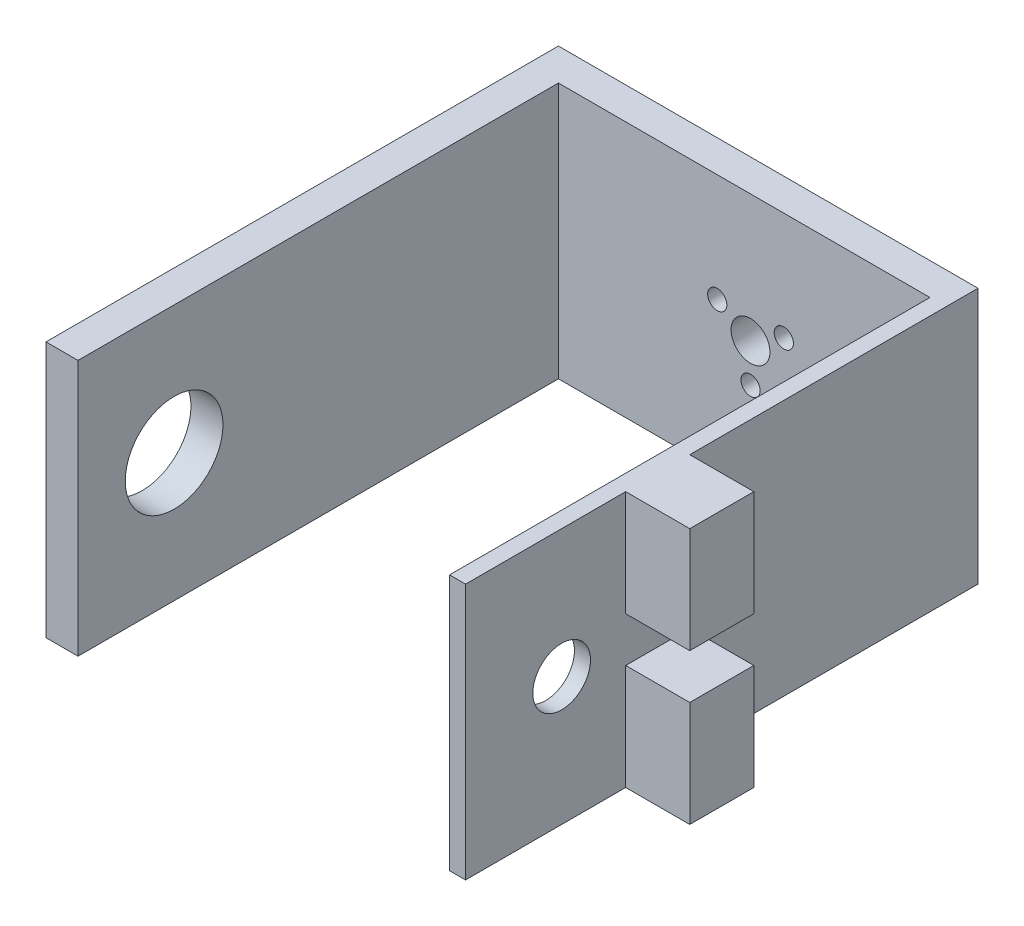
ISO-10303-21;
HEADER;
FILE_DESCRIPTION(('STEP AP214'),'2;1');
FILE_NAME('part.step','',(''),(''),'','','');
FILE_SCHEMA(('AUTOMOTIVE_DESIGN { 1 0 10303 214 1 1 1 1 }'));
ENDSEC;
DATA;
#1=APPLICATION_CONTEXT('core data for automotive mechanical design processes');
#2=APPLICATION_PROTOCOL_DEFINITION('international standard','automotive_design',2000,#1);
#3=PRODUCT_CONTEXT('',#1,'mechanical');
#4=PRODUCT('Part','Part','',(#3));
#5=PRODUCT_RELATED_PRODUCT_CATEGORY('part','',(#4));
#6=PRODUCT_DEFINITION_FORMATION('','',#4);
#7=PRODUCT_DEFINITION_CONTEXT('part definition',#1,'design');
#8=PRODUCT_DEFINITION('design','',#6,#7);
#9=PRODUCT_DEFINITION_SHAPE('','',#8);
#10=(LENGTH_UNIT() NAMED_UNIT(*) SI_UNIT(.MILLI.,.METRE.));
#11=(NAMED_UNIT(*) PLANE_ANGLE_UNIT() SI_UNIT($,.RADIAN.));
#12=(NAMED_UNIT(*) SI_UNIT($,.STERADIAN.) SOLID_ANGLE_UNIT());
#13=UNCERTAINTY_MEASURE_WITH_UNIT(LENGTH_MEASURE(1.E-05),#10,'distance_accuracy_value','');
#14=(GEOMETRIC_REPRESENTATION_CONTEXT(3) GLOBAL_UNCERTAINTY_ASSIGNED_CONTEXT((#13)) GLOBAL_UNIT_ASSIGNED_CONTEXT((#10,
#11,#12)) REPRESENTATION_CONTEXT('',''));
#15=CARTESIAN_POINT('',(0.,0.,0.));
#16=DIRECTION('',(0.,0.,1.));
#17=DIRECTION('',(1.,0.,0.));
#18=AXIS2_PLACEMENT_3D('',#15,#16,#17);
#19=CARTESIAN_POINT('',(30.5,40.,42.2692929036653));
#20=DIRECTION('',(-1.,0.,0.));
#21=DIRECTION('',(0.,0.,1.));
#22=AXIS2_PLACEMENT_3D('',#19,#20,#21);
#23=PLANE('',#22);
#24=CARTESIAN_POINT('',(30.5,20.,27.2692929036653));
#25=DIRECTION('',(1.,0.,0.));
#26=DIRECTION('',(0.,0.,-1.));
#27=AXIS2_PLACEMENT_3D('',#24,#25,#26);
#28=CIRCLE('',#27,4.5);
#29=CARTESIAN_POINT('',(30.5,20.,22.7692929036653));
#30=VERTEX_POINT('',#29);
#31=EDGE_CURVE('E216',#30,#30,#28,.T.);
#32=ORIENTED_EDGE('',*,*,#31,.F.);
#33=EDGE_LOOP('',(#32));
#34=FACE_BOUND('',#33,.T.);
#35=DIRECTION('',(0.,0.,-1.));
#36=VECTOR('',#35,1.);
#37=CARTESIAN_POINT('',(30.5,23.5,0.));
#38=LINE('',#37,#36);
#39=CARTESIAN_POINT('',(30.5,23.5,17.2692929036653));
#40=VERTEX_POINT('',#39);
#41=CARTESIAN_POINT('',(30.5,23.5,7.26929290366533));
#42=VERTEX_POINT('',#41);
#43=EDGE_CURVE('E177',#40,#42,#38,.T.);
#44=ORIENTED_EDGE('',*,*,#43,.F.);
#45=DIRECTION('',(0.,1.,0.));
#46=VECTOR('',#45,1.);
#47=CARTESIAN_POINT('',(30.5,0.,17.2692929036653));
#48=LINE('',#47,#46);
#49=CARTESIAN_POINT('',(30.5,40.,17.2692929036653));
#50=VERTEX_POINT('',#49);
#51=EDGE_CURVE('E159',#40,#50,#48,.T.);
#52=ORIENTED_EDGE('',*,*,#51,.T.);
#53=DIRECTION('',(0.,0.,-1.));
#54=VECTOR('',#53,1.);
#55=CARTESIAN_POINT('',(30.5,40.,42.2692929036653));
#56=LINE('',#55,#54);
#57=CARTESIAN_POINT('',(30.5,40.,42.2692929036653));
#58=VERTEX_POINT('',#57);
#59=EDGE_CURVE('E262',#58,#50,#56,.T.);
#60=ORIENTED_EDGE('',*,*,#59,.F.);
#61=DIRECTION('',(0.,-1.,0.));
#62=VECTOR('',#61,1.);
#63=CARTESIAN_POINT('',(30.5,40.,42.2692929036653));
#64=LINE('',#63,#62);
#65=CARTESIAN_POINT('',(30.5,0.,42.2692929036653));
#66=VERTEX_POINT('',#65);
#67=EDGE_CURVE('E290',#58,#66,#64,.T.);
#68=ORIENTED_EDGE('',*,*,#67,.T.);
#69=DIRECTION('',(0.,0.,-1.));
#70=VECTOR('',#69,1.);
#71=CARTESIAN_POINT('',(30.5,0.,42.2692929036653));
#72=LINE('',#71,#70);
#73=CARTESIAN_POINT('',(30.5,0.,17.2692929036653));
#74=VERTEX_POINT('',#73);
#75=EDGE_CURVE('E281',#66,#74,#72,.T.);
#76=ORIENTED_EDGE('',*,*,#75,.T.);
#77=DIRECTION('',(0.,1.,0.));
#78=VECTOR('',#77,1.);
#79=CARTESIAN_POINT('',(30.5,0.,17.2692929036653));
#80=LINE('',#79,#78);
#81=CARTESIAN_POINT('',(30.5,16.5,17.2692929036653));
#82=VERTEX_POINT('',#81);
#83=EDGE_CURVE('E204',#74,#82,#80,.T.);
#84=ORIENTED_EDGE('',*,*,#83,.T.);
#85=DIRECTION('',(0.,0.,-1.));
#86=VECTOR('',#85,1.);
#87=CARTESIAN_POINT('',(30.5,16.5,0.));
#88=LINE('',#87,#86);
#89=CARTESIAN_POINT('',(30.5,16.5,7.26929290366533));
#90=VERTEX_POINT('',#89);
#91=EDGE_CURVE('E62',#82,#90,#88,.T.);
#92=ORIENTED_EDGE('',*,*,#91,.T.);
#93=DIRECTION('',(0.,1.,0.));
#94=VECTOR('',#93,1.);
#95=CARTESIAN_POINT('',(30.5,0.,7.26929290366533));
#96=LINE('',#95,#94);
#97=CARTESIAN_POINT('',(30.5,0.,7.26929290366533));
#98=VERTEX_POINT('',#97);
#99=EDGE_CURVE('E195',#98,#90,#96,.T.);
#100=ORIENTED_EDGE('',*,*,#99,.F.);
#101=CARTESIAN_POINT('',(30.5,0.,-37.7307070963347));
#102=VERTEX_POINT('',#101);
#103=EDGE_CURVE('E280',#98,#102,#72,.T.);
#104=ORIENTED_EDGE('',*,*,#103,.T.);
#105=DIRECTION('',(0.,-1.,0.));
#106=VECTOR('',#105,1.);
#107=CARTESIAN_POINT('',(30.5,40.,-37.7307070963347));
#108=LINE('',#107,#106);
#109=CARTESIAN_POINT('',(30.5,40.,-37.7307070963347));
#110=VERTEX_POINT('',#109);
#111=EDGE_CURVE('E287',#110,#102,#108,.T.);
#112=ORIENTED_EDGE('',*,*,#111,.F.);
#113=CARTESIAN_POINT('',(30.5,40.,7.26929290366533));
#114=VERTEX_POINT('',#113);
#115=EDGE_CURVE('E261',#114,#110,#56,.T.);
#116=ORIENTED_EDGE('',*,*,#115,.F.);
#117=DIRECTION('',(0.,1.,0.));
#118=VECTOR('',#117,1.);
#119=CARTESIAN_POINT('',(30.5,0.,7.26929290366533));
#120=LINE('',#119,#118);
#121=EDGE_CURVE('E175',#42,#114,#120,.T.);
#122=ORIENTED_EDGE('',*,*,#121,.F.);
#123=EDGE_LOOP('',(#44,#52,#60,#68,#76,#84,#92,#100,#104,#112,#116,#122));
#124=FACE_BOUND('',#123,.T.);
#125=ADVANCED_FACE('F39',(#34,#124),#23,.F.);
#126=CARTESIAN_POINT('',(-35.,40.,42.2692929036653));
#127=DIRECTION('',(1.,0.,0.));
#128=DIRECTION('',(0.,0.,-1.));
#129=AXIS2_PLACEMENT_3D('',#126,#127,#128);
#130=PLANE('',#129);
#131=CARTESIAN_POINT('',(-35.,20.,27.2692929036653));
#132=DIRECTION('',(-1.,0.,0.));
#133=DIRECTION('',(0.,0.,1.));
#134=AXIS2_PLACEMENT_3D('',#131,#132,#133);
#135=CIRCLE('',#134,7.625);
#136=CARTESIAN_POINT('',(-35.,20.,34.8942929036653));
#137=VERTEX_POINT('',#136);
#138=EDGE_CURVE('E222',#137,#137,#135,.T.);
#139=ORIENTED_EDGE('',*,*,#138,.F.);
#140=EDGE_LOOP('',(#139));
#141=FACE_BOUND('',#140,.T.);
#142=DIRECTION('',(0.,0.,1.));
#143=VECTOR('',#142,1.);
#144=CARTESIAN_POINT('',(-35.,0.,42.2692929036653));
#145=LINE('',#144,#143);
#146=CARTESIAN_POINT('',(-35.,0.,-37.7307070963347));
#147=VERTEX_POINT('',#146);
#148=CARTESIAN_POINT('',(-35.,0.,42.2692929036653));
#149=VERTEX_POINT('',#148);
#150=EDGE_CURVE('E246',#147,#149,#145,.T.);
#151=ORIENTED_EDGE('',*,*,#150,.T.);
#152=DIRECTION('',(0.,-1.,0.));
#153=VECTOR('',#152,1.);
#154=CARTESIAN_POINT('',(-35.,40.,42.2692929036653));
#155=LINE('',#154,#153);
#156=CARTESIAN_POINT('',(-35.,40.,42.2692929036653));
#157=VERTEX_POINT('',#156);
#158=EDGE_CURVE('E11',#157,#149,#155,.T.);
#159=ORIENTED_EDGE('',*,*,#158,.F.);
#160=DIRECTION('',(0.,0.,1.));
#161=VECTOR('',#160,1.);
#162=CARTESIAN_POINT('',(-35.,40.,42.2692929036653));
#163=LINE('',#162,#161);
#164=CARTESIAN_POINT('',(-35.,40.,-37.7307070963347));
#165=VERTEX_POINT('',#164);
#166=EDGE_CURVE('E247',#165,#157,#163,.T.);
#167=ORIENTED_EDGE('',*,*,#166,.F.);
#168=DIRECTION('',(0.,-1.,0.));
#169=VECTOR('',#168,1.);
#170=CARTESIAN_POINT('',(-35.,40.,-37.7307070963347));
#171=LINE('',#170,#169);
#172=EDGE_CURVE('E267',#165,#147,#171,.T.);
#173=ORIENTED_EDGE('',*,*,#172,.T.);
#174=EDGE_LOOP('',(#151,#159,#167,#173));
#175=FACE_BOUND('',#174,.T.);
#176=ADVANCED_FACE('F41',(#141,#175),#130,.F.);
#177=CARTESIAN_POINT('',(-35.,40.,42.2692929036653));
#178=DIRECTION('',(0.,0.,-1.));
#179=DIRECTION('',(-1.,0.,0.));
#180=AXIS2_PLACEMENT_3D('',#177,#178,#179);
#181=PLANE('',#180);
#182=DIRECTION('',(1.,0.,0.));
#183=VECTOR('',#182,1.);
#184=CARTESIAN_POINT('',(-35.,0.,42.2692929036653));
#185=LINE('',#184,#183);
#186=CARTESIAN_POINT('',(-30.,0.,42.2692929036653));
#187=VERTEX_POINT('',#186);
#188=EDGE_CURVE('E270',#149,#187,#185,.T.);
#189=ORIENTED_EDGE('',*,*,#188,.T.);
#190=DIRECTION('',(0.,-1.,0.));
#191=VECTOR('',#190,1.);
#192=CARTESIAN_POINT('',(-30.,40.,42.2692929036653));
#193=LINE('',#192,#191);
#194=CARTESIAN_POINT('',(-30.,40.,42.2692929036653));
#195=VERTEX_POINT('',#194);
#196=EDGE_CURVE('E47',#195,#187,#193,.T.);
#197=ORIENTED_EDGE('',*,*,#196,.F.);
#198=DIRECTION('',(1.,0.,0.));
#199=VECTOR('',#198,1.);
#200=CARTESIAN_POINT('',(-35.,40.,42.2692929036653));
#201=LINE('',#200,#199);
#202=EDGE_CURVE('E250',#157,#195,#201,.T.);
#203=ORIENTED_EDGE('',*,*,#202,.F.);
#204=ORIENTED_EDGE('',*,*,#158,.T.);
#205=EDGE_LOOP('',(#189,#197,#203,#204));
#206=FACE_BOUND('',#205,.T.);
#207=ADVANCED_FACE('F328',(#206),#181,.F.);
#208=CARTESIAN_POINT('',(-30.,40.,42.2692929036653));
#209=DIRECTION('',(-1.,0.,0.));
#210=DIRECTION('',(0.,0.,1.));
#211=AXIS2_PLACEMENT_3D('',#208,#209,#210);
#212=PLANE('',#211);
#213=CARTESIAN_POINT('',(-30.,20.,27.2692929036653));
#214=DIRECTION('',(-1.,0.,0.));
#215=DIRECTION('',(0.,0.,1.));
#216=AXIS2_PLACEMENT_3D('',#213,#214,#215);
#217=CIRCLE('',#216,7.625);
#218=CARTESIAN_POINT('',(-30.,20.,34.8942929036653));
#219=VERTEX_POINT('',#218);
#220=EDGE_CURVE('E223',#219,#219,#217,.F.);
#221=ORIENTED_EDGE('',*,*,#220,.F.);
#222=EDGE_LOOP('',(#221));
#223=FACE_BOUND('',#222,.T.);
#224=DIRECTION('',(0.,0.,-1.));
#225=VECTOR('',#224,1.);
#226=CARTESIAN_POINT('',(-30.,0.,42.2692929036653));
#227=LINE('',#226,#225);
#228=CARTESIAN_POINT('',(-30.,0.,-32.7307070963347));
#229=VERTEX_POINT('',#228);
#230=EDGE_CURVE('E272',#187,#229,#227,.T.);
#231=ORIENTED_EDGE('',*,*,#230,.T.);
#232=DIRECTION('',(0.,-1.,0.));
#233=VECTOR('',#232,1.);
#234=CARTESIAN_POINT('',(-30.,40.,-32.7307070963347));
#235=LINE('',#234,#233);
#236=CARTESIAN_POINT('',(-30.,40.,-32.7307070963347));
#237=VERTEX_POINT('',#236);
#238=EDGE_CURVE('E299',#237,#229,#235,.T.);
#239=ORIENTED_EDGE('',*,*,#238,.F.);
#240=DIRECTION('',(0.,0.,-1.));
#241=VECTOR('',#240,1.);
#242=CARTESIAN_POINT('',(-30.,40.,42.2692929036653));
#243=LINE('',#242,#241);
#244=EDGE_CURVE('E253',#195,#237,#243,.T.);
#245=ORIENTED_EDGE('',*,*,#244,.F.);
#246=ORIENTED_EDGE('',*,*,#196,.T.);
#247=EDGE_LOOP('',(#231,#239,#245,#246));
#248=FACE_BOUND('',#247,.T.);
#249=ADVANCED_FACE('F306',(#223,#248),#212,.F.);
#250=CARTESIAN_POINT('',(-30.,40.,-32.7307070963347));
#251=DIRECTION('',(0.,0.,-1.));
#252=DIRECTION('',(-1.,0.,0.));
#253=AXIS2_PLACEMENT_3D('',#250,#251,#252);
#254=PLANE('',#253);
#255=CARTESIAN_POINT('',(-0.0121898136353316,20.1255891767881,-32.7307070963347));
#256=DIRECTION('',(0.,0.,-1.));
#257=DIRECTION('',(-1.,0.,0.));
#258=AXIS2_PLACEMENT_3D('',#255,#256,#257);
#259=CIRCLE('',#258,3.035);
#260=CARTESIAN_POINT('',(-3.04718981363533,20.1255891767881,-32.7307070963347));
#261=VERTEX_POINT('',#260);
#262=EDGE_CURVE('E180',#261,#261,#259,.F.);
#263=ORIENTED_EDGE('',*,*,#262,.F.);
#264=EDGE_LOOP('',(#263));
#265=FACE_BOUND('',#264,.T.);
#266=CARTESIAN_POINT('',(-5.20834223634197,23.1255891767881,-32.7307070963347));
#267=DIRECTION('',(0.,0.,-1.));
#268=DIRECTION('',(-1.,0.,0.));
#269=AXIS2_PLACEMENT_3D('',#266,#267,#268);
#270=CIRCLE('',#269,1.5);
#271=CARTESIAN_POINT('',(-6.70834223634197,23.1255891767881,-32.7307070963347));
#272=VERTEX_POINT('',#271);
#273=EDGE_CURVE('E243',#272,#272,#270,.T.);
#274=ORIENTED_EDGE('',*,*,#273,.T.);
#275=EDGE_LOOP('',(#274));
#276=FACE_BOUND('',#275,.T.);
#277=CARTESIAN_POINT('',(-0.0121898136353845,14.1255891767881,-32.7307070963347));
#278=DIRECTION('',(0.,0.,-1.));
#279=DIRECTION('',(-1.,0.,0.));
#280=AXIS2_PLACEMENT_3D('',#277,#278,#279);
#281=CIRCLE('',#280,1.5);
#282=CARTESIAN_POINT('',(-1.51218981363538,14.1255891767881,-32.7307070963347));
#283=VERTEX_POINT('',#282);
#284=EDGE_CURVE('E240',#283,#283,#281,.T.);
#285=ORIENTED_EDGE('',*,*,#284,.T.);
#286=EDGE_LOOP('',(#285));
#287=FACE_BOUND('',#286,.T.);
#288=CARTESIAN_POINT('',(5.18396260907134,23.125589176788,-32.7307070963347));
#289=DIRECTION('',(0.,0.,-1.));
#290=DIRECTION('',(-1.,0.,0.));
#291=AXIS2_PLACEMENT_3D('',#288,#289,#290);
#292=CIRCLE('',#291,1.5);
#293=CARTESIAN_POINT('',(3.68396260907134,23.125589176788,-32.7307070963347));
#294=VERTEX_POINT('',#293);
#295=EDGE_CURVE('E232',#294,#294,#292,.T.);
#296=ORIENTED_EDGE('',*,*,#295,.T.);
#297=EDGE_LOOP('',(#296));
#298=FACE_BOUND('',#297,.T.);
#299=DIRECTION('',(1.,0.,0.));
#300=VECTOR('',#299,1.);
#301=CARTESIAN_POINT('',(-30.,0.,-32.7307070963347));
#302=LINE('',#301,#300);
#303=CARTESIAN_POINT('',(28.,0.,-32.7307070963347));
#304=VERTEX_POINT('',#303);
#305=EDGE_CURVE('E274',#229,#304,#302,.T.);
#306=ORIENTED_EDGE('',*,*,#305,.T.);
#307=DIRECTION('',(0.,-1.,0.));
#308=VECTOR('',#307,1.);
#309=CARTESIAN_POINT('',(28.,40.,-32.7307070963347));
#310=LINE('',#309,#308);
#311=CARTESIAN_POINT('',(28.,40.,-32.7307070963347));
#312=VERTEX_POINT('',#311);
#313=EDGE_CURVE('E296',#312,#304,#310,.T.);
#314=ORIENTED_EDGE('',*,*,#313,.F.);
#315=DIRECTION('',(1.,0.,0.));
#316=VECTOR('',#315,1.);
#317=CARTESIAN_POINT('',(-30.,40.,-32.7307070963347));
#318=LINE('',#317,#316);
#319=EDGE_CURVE('E255',#237,#312,#318,.T.);
#320=ORIENTED_EDGE('',*,*,#319,.F.);
#321=ORIENTED_EDGE('',*,*,#238,.T.);
#322=EDGE_LOOP('',(#306,#314,#320,#321));
#323=FACE_BOUND('',#322,.T.);
#324=ADVANCED_FACE('F317',(#265,#276,#287,#298,#323),#254,.F.);
#325=CARTESIAN_POINT('',(28.,40.,-32.7307070963347));
#326=DIRECTION('',(1.,0.,0.));
#327=DIRECTION('',(0.,0.,-1.));
#328=AXIS2_PLACEMENT_3D('',#325,#326,#327);
#329=PLANE('',#328);
#330=CARTESIAN_POINT('',(28.,20.,27.2692929036653));
#331=DIRECTION('',(1.,0.,0.));
#332=DIRECTION('',(0.,0.,-1.));
#333=AXIS2_PLACEMENT_3D('',#330,#331,#332);
#334=CIRCLE('',#333,4.5);
#335=CARTESIAN_POINT('',(28.,20.,22.7692929036653));
#336=VERTEX_POINT('',#335);
#337=EDGE_CURVE('E219',#336,#336,#334,.T.);
#338=ORIENTED_EDGE('',*,*,#337,.T.);
#339=EDGE_LOOP('',(#338));
#340=FACE_BOUND('',#339,.T.);
#341=DIRECTION('',(0.,0.,1.));
#342=VECTOR('',#341,1.);
#343=CARTESIAN_POINT('',(28.,0.,-32.7307070963347));
#344=LINE('',#343,#342);
#345=CARTESIAN_POINT('',(28.,0.,42.2692929036653));
#346=VERTEX_POINT('',#345);
#347=EDGE_CURVE('E276',#304,#346,#344,.T.);
#348=ORIENTED_EDGE('',*,*,#347,.T.);
#349=DIRECTION('',(0.,-1.,0.));
#350=VECTOR('',#349,1.);
#351=CARTESIAN_POINT('',(28.,40.,42.2692929036653));
#352=LINE('',#351,#350);
#353=CARTESIAN_POINT('',(28.,40.,42.2692929036653));
#354=VERTEX_POINT('',#353);
#355=EDGE_CURVE('E293',#354,#346,#352,.T.);
#356=ORIENTED_EDGE('',*,*,#355,.F.);
#357=DIRECTION('',(0.,0.,1.));
#358=VECTOR('',#357,1.);
#359=CARTESIAN_POINT('',(28.,40.,-32.7307070963347));
#360=LINE('',#359,#358);
#361=EDGE_CURVE('E257',#312,#354,#360,.T.);
#362=ORIENTED_EDGE('',*,*,#361,.F.);
#363=ORIENTED_EDGE('',*,*,#313,.T.);
#364=EDGE_LOOP('',(#348,#356,#362,#363));
#365=FACE_BOUND('',#364,.T.);
#366=ADVANCED_FACE('F321',(#340,#365),#329,.F.);
#367=CARTESIAN_POINT('',(28.,40.,42.2692929036653));
#368=DIRECTION('',(0.,0.,-1.));
#369=DIRECTION('',(-1.,0.,0.));
#370=AXIS2_PLACEMENT_3D('',#367,#368,#369);
#371=PLANE('',#370);
#372=DIRECTION('',(1.,0.,0.));
#373=VECTOR('',#372,1.);
#374=CARTESIAN_POINT('',(28.,0.,42.2692929036653));
#375=LINE('',#374,#373);
#376=EDGE_CURVE('E278',#346,#66,#375,.T.);
#377=ORIENTED_EDGE('',*,*,#376,.T.);
#378=ORIENTED_EDGE('',*,*,#67,.F.);
#379=DIRECTION('',(1.,0.,0.));
#380=VECTOR('',#379,1.);
#381=CARTESIAN_POINT('',(28.,40.,42.2692929036653));
#382=LINE('',#381,#380);
#383=EDGE_CURVE('E259',#354,#58,#382,.T.);
#384=ORIENTED_EDGE('',*,*,#383,.F.);
#385=ORIENTED_EDGE('',*,*,#355,.T.);
#386=EDGE_LOOP('',(#377,#378,#384,#385));
#387=FACE_BOUND('',#386,.T.);
#388=ADVANCED_FACE('F357',(#387),#371,.F.);
#389=CARTESIAN_POINT('',(30.5,40.,-37.7307070963347));
#390=DIRECTION('',(0.,0.,1.));
#391=DIRECTION('',(1.,0.,0.));
#392=AXIS2_PLACEMENT_3D('',#389,#390,#391);
#393=PLANE('',#392);
#394=CARTESIAN_POINT('',(-0.0121898136353322,20.1255891767881,-37.7307070963347));
#395=DIRECTION('',(0.,0.,-1.));
#396=DIRECTION('',(-1.,0.,0.));
#397=AXIS2_PLACEMENT_3D('',#394,#395,#396);
#398=CIRCLE('',#397,3.035);
#399=CARTESIAN_POINT('',(-3.04718981363533,20.1255891767881,-37.7307070963347));
#400=VERTEX_POINT('',#399);
#401=EDGE_CURVE('E639',#400,#400,#398,.T.);
#402=ORIENTED_EDGE('',*,*,#401,.F.);
#403=EDGE_LOOP('',(#402));
#404=FACE_BOUND('',#403,.T.);
#405=CARTESIAN_POINT('',(-5.20834223634197,23.1255891767881,-37.7307070963347));
#406=DIRECTION('',(0.,0.,-1.));
#407=DIRECTION('',(-1.,0.,0.));
#408=AXIS2_PLACEMENT_3D('',#405,#406,#407);
#409=CIRCLE('',#408,1.5);
#410=CARTESIAN_POINT('',(-6.70834223634197,23.1255891767881,-37.7307070963347));
#411=VERTEX_POINT('',#410);
#412=EDGE_CURVE('E229',#411,#411,#409,.T.);
#413=ORIENTED_EDGE('',*,*,#412,.F.);
#414=EDGE_LOOP('',(#413));
#415=FACE_BOUND('',#414,.T.);
#416=CARTESIAN_POINT('',(-0.0121898136353851,14.1255891767881,-37.7307070963347));
#417=DIRECTION('',(0.,0.,-1.));
#418=DIRECTION('',(-1.,0.,0.));
#419=AXIS2_PLACEMENT_3D('',#416,#417,#418);
#420=CIRCLE('',#419,1.5);
#421=CARTESIAN_POINT('',(-1.51218981363539,14.1255891767881,-37.7307070963347));
#422=VERTEX_POINT('',#421);
#423=EDGE_CURVE('E233',#422,#422,#420,.T.);
#424=ORIENTED_EDGE('',*,*,#423,.F.);
#425=EDGE_LOOP('',(#424));
#426=FACE_BOUND('',#425,.T.);
#427=CARTESIAN_POINT('',(5.18396260907134,23.125589176788,-37.7307070963347));
#428=DIRECTION('',(0.,0.,-1.));
#429=DIRECTION('',(-1.,0.,0.));
#430=AXIS2_PLACEMENT_3D('',#427,#428,#429);
#431=CIRCLE('',#430,1.5);
#432=CARTESIAN_POINT('',(3.68396260907134,23.125589176788,-37.7307070963347));
#433=VERTEX_POINT('',#432);
#434=EDGE_CURVE('E226',#433,#433,#431,.T.);
#435=ORIENTED_EDGE('',*,*,#434,.F.);
#436=EDGE_LOOP('',(#435));
#437=FACE_BOUND('',#436,.T.);
#438=DIRECTION('',(-1.,0.,0.));
#439=VECTOR('',#438,1.);
#440=CARTESIAN_POINT('',(30.5,0.,-37.7307070963347));
#441=LINE('',#440,#439);
#442=EDGE_CURVE('E251',#102,#147,#441,.T.);
#443=ORIENTED_EDGE('',*,*,#442,.T.);
#444=ORIENTED_EDGE('',*,*,#172,.F.);
#445=DIRECTION('',(-1.,0.,0.));
#446=VECTOR('',#445,1.);
#447=CARTESIAN_POINT('',(30.5,40.,-37.7307070963347));
#448=LINE('',#447,#446);
#449=EDGE_CURVE('E265',#110,#165,#448,.T.);
#450=ORIENTED_EDGE('',*,*,#449,.F.);
#451=ORIENTED_EDGE('',*,*,#111,.T.);
#452=EDGE_LOOP('',(#443,#444,#450,#451));
#453=FACE_BOUND('',#452,.T.);
#454=ADVANCED_FACE('F335',(#404,#415,#426,#437,#453),#393,.F.);
#455=CARTESIAN_POINT('',(0.,40.,0.));
#456=DIRECTION('',(0.,1.,0.));
#457=DIRECTION('',(0.,0.,1.));
#458=AXIS2_PLACEMENT_3D('',#455,#456,#457);
#459=PLANE('',#458);
#460=ORIENTED_EDGE('',*,*,#166,.T.);
#461=ORIENTED_EDGE('',*,*,#202,.T.);
#462=ORIENTED_EDGE('',*,*,#244,.T.);
#463=ORIENTED_EDGE('',*,*,#319,.T.);
#464=ORIENTED_EDGE('',*,*,#361,.T.);
#465=ORIENTED_EDGE('',*,*,#383,.T.);
#466=ORIENTED_EDGE('',*,*,#59,.T.);
#467=DIRECTION('',(-1.,0.,0.));
#468=VECTOR('',#467,1.);
#469=CARTESIAN_POINT('',(40.5,40.,17.2692929036653));
#470=LINE('',#469,#468);
#471=CARTESIAN_POINT('',(40.5,40.,17.2692929036653));
#472=VERTEX_POINT('',#471);
#473=EDGE_CURVE('E185',#472,#50,#470,.T.);
#474=ORIENTED_EDGE('',*,*,#473,.F.);
#475=DIRECTION('',(0.,0.,1.));
#476=VECTOR('',#475,1.);
#477=CARTESIAN_POINT('',(40.5,40.,0.));
#478=LINE('',#477,#476);
#479=CARTESIAN_POINT('',(40.5,40.,7.26929290366533));
#480=VERTEX_POINT('',#479);
#481=EDGE_CURVE('E173',#480,#472,#478,.T.);
#482=ORIENTED_EDGE('',*,*,#481,.F.);
#483=DIRECTION('',(-1.,0.,0.));
#484=VECTOR('',#483,1.);
#485=CARTESIAN_POINT('',(40.5,40.,7.26929290366533));
#486=LINE('',#485,#484);
#487=EDGE_CURVE('E54',#480,#114,#486,.T.);
#488=ORIENTED_EDGE('',*,*,#487,.T.);
#489=ORIENTED_EDGE('',*,*,#115,.T.);
#490=ORIENTED_EDGE('',*,*,#449,.T.);
#491=EDGE_LOOP('',(#460,#461,#462,#463,#464,#465,#466,#474,#482,#488,#489,#490));
#492=FACE_BOUND('',#491,.T.);
#493=ADVANCED_FACE('F324',(#492),#459,.T.);
#494=CARTESIAN_POINT('',(0.,0.,0.));
#495=DIRECTION('',(0.,1.,0.));
#496=DIRECTION('',(0.,0.,1.));
#497=AXIS2_PLACEMENT_3D('',#494,#495,#496);
#498=PLANE('',#497);
#499=ORIENTED_EDGE('',*,*,#150,.F.);
#500=ORIENTED_EDGE('',*,*,#442,.F.);
#501=ORIENTED_EDGE('',*,*,#103,.F.);
#502=DIRECTION('',(-1.,0.,0.));
#503=VECTOR('',#502,1.);
#504=CARTESIAN_POINT('',(40.5,0.,7.26929290366533));
#505=LINE('',#504,#503);
#506=CARTESIAN_POINT('',(40.5,0.,7.26929290366533));
#507=VERTEX_POINT('',#506);
#508=EDGE_CURVE('E210',#507,#98,#505,.T.);
#509=ORIENTED_EDGE('',*,*,#508,.F.);
#510=DIRECTION('',(0.,0.,-1.));
#511=VECTOR('',#510,1.);
#512=CARTESIAN_POINT('',(40.5,0.,0.));
#513=LINE('',#512,#511);
#514=CARTESIAN_POINT('',(40.5,0.,17.2692929036653));
#515=VERTEX_POINT('',#514);
#516=EDGE_CURVE('E198',#515,#507,#513,.T.);
#517=ORIENTED_EDGE('',*,*,#516,.F.);
#518=DIRECTION('',(-1.,0.,0.));
#519=VECTOR('',#518,1.);
#520=CARTESIAN_POINT('',(40.5,0.,17.2692929036653));
#521=LINE('',#520,#519);
#522=EDGE_CURVE('E212',#515,#74,#521,.T.);
#523=ORIENTED_EDGE('',*,*,#522,.T.);
#524=ORIENTED_EDGE('',*,*,#75,.F.);
#525=ORIENTED_EDGE('',*,*,#376,.F.);
#526=ORIENTED_EDGE('',*,*,#347,.F.);
#527=ORIENTED_EDGE('',*,*,#305,.F.);
#528=ORIENTED_EDGE('',*,*,#230,.F.);
#529=ORIENTED_EDGE('',*,*,#188,.F.);
#530=EDGE_LOOP('',(#499,#500,#501,#509,#517,#523,#524,#525,#526,#527,#528,#529));
#531=FACE_BOUND('',#530,.T.);
#532=ADVANCED_FACE('F312',(#531),#498,.F.);
#533=CARTESIAN_POINT('',(5.18396260907134,23.125589176788,42.2692929036653));
#534=DIRECTION('',(0.,0.,-1.));
#535=DIRECTION('',(-1.,0.,0.));
#536=AXIS2_PLACEMENT_3D('',#533,#534,#535);
#537=CYLINDRICAL_SURFACE('',#536,1.5);
#538=ORIENTED_EDGE('',*,*,#434,.T.);
#539=EDGE_LOOP('',(#538));
#540=FACE_BOUND('',#539,.T.);
#541=ORIENTED_EDGE('',*,*,#295,.F.);
#542=EDGE_LOOP('',(#541));
#543=FACE_BOUND('',#542,.T.);
#544=ADVANCED_FACE('F434',(#540,#543),#537,.F.);
#545=CARTESIAN_POINT('',(-0.0121898136353761,14.1255891767881,42.2692929036653));
#546=DIRECTION('',(0.,0.,-1.));
#547=DIRECTION('',(-1.,0.,0.));
#548=AXIS2_PLACEMENT_3D('',#545,#546,#547);
#549=CYLINDRICAL_SURFACE('',#548,1.5);
#550=ORIENTED_EDGE('',*,*,#423,.T.);
#551=EDGE_LOOP('',(#550));
#552=FACE_BOUND('',#551,.T.);
#553=ORIENTED_EDGE('',*,*,#284,.F.);
#554=EDGE_LOOP('',(#553));
#555=FACE_BOUND('',#554,.T.);
#556=ADVANCED_FACE('F440',(#552,#555),#549,.F.);
#557=CARTESIAN_POINT('',(-5.20834223634196,23.1255891767881,42.2692929036653));
#558=DIRECTION('',(0.,0.,-1.));
#559=DIRECTION('',(-1.,0.,0.));
#560=AXIS2_PLACEMENT_3D('',#557,#558,#559);
#561=CYLINDRICAL_SURFACE('',#560,1.5);
#562=ORIENTED_EDGE('',*,*,#412,.T.);
#563=EDGE_LOOP('',(#562));
#564=FACE_BOUND('',#563,.T.);
#565=ORIENTED_EDGE('',*,*,#273,.F.);
#566=EDGE_LOOP('',(#565));
#567=FACE_BOUND('',#566,.T.);
#568=ADVANCED_FACE('F448',(#564,#567),#561,.F.);
#569=CARTESIAN_POINT('',(30.501,20.,27.2692929036653));
#570=DIRECTION('',(-1.,0.,0.));
#571=DIRECTION('',(0.,0.,1.));
#572=AXIS2_PLACEMENT_3D('',#569,#570,#571);
#573=CYLINDRICAL_SURFACE('',#572,7.625);
#574=ORIENTED_EDGE('',*,*,#138,.T.);
#575=EDGE_LOOP('',(#574));
#576=FACE_BOUND('',#575,.T.);
#577=ORIENTED_EDGE('',*,*,#220,.T.);
#578=EDGE_LOOP('',(#577));
#579=FACE_BOUND('',#578,.T.);
#580=ADVANCED_FACE('F456',(#576,#579),#573,.F.);
#581=CARTESIAN_POINT('',(20.5,20.,27.2692929036653));
#582=DIRECTION('',(1.,0.,0.));
#583=DIRECTION('',(0.,0.,-1.));
#584=AXIS2_PLACEMENT_3D('',#581,#582,#583);
#585=CYLINDRICAL_SURFACE('',#584,4.5);
#586=ORIENTED_EDGE('',*,*,#31,.T.);
#587=EDGE_LOOP('',(#586));
#588=FACE_BOUND('',#587,.T.);
#589=ORIENTED_EDGE('',*,*,#337,.F.);
#590=EDGE_LOOP('',(#589));
#591=FACE_BOUND('',#590,.T.);
#592=ADVANCED_FACE('F463',(#588,#591),#585,.F.);
#593=CARTESIAN_POINT('',(40.5,16.5,0.));
#594=DIRECTION('',(0.,1.,0.));
#595=DIRECTION('',(0.,0.,1.));
#596=AXIS2_PLACEMENT_3D('',#593,#594,#595);
#597=PLANE('',#596);
#598=ORIENTED_EDGE('',*,*,#91,.F.);
#599=DIRECTION('',(-1.,0.,0.));
#600=VECTOR('',#599,1.);
#601=CARTESIAN_POINT('',(40.5,16.5,17.2692929036653));
#602=LINE('',#601,#600);
#603=CARTESIAN_POINT('',(40.5,16.5,17.2692929036653));
#604=VERTEX_POINT('',#603);
#605=EDGE_CURVE('E214',#604,#82,#602,.T.);
#606=ORIENTED_EDGE('',*,*,#605,.F.);
#607=DIRECTION('',(0.,0.,-1.));
#608=VECTOR('',#607,1.);
#609=CARTESIAN_POINT('',(40.5,16.5,0.));
#610=LINE('',#609,#608);
#611=CARTESIAN_POINT('',(40.5,16.5,7.26929290366533));
#612=VERTEX_POINT('',#611);
#613=EDGE_CURVE('E191',#604,#612,#610,.T.);
#614=ORIENTED_EDGE('',*,*,#613,.T.);
#615=DIRECTION('',(-1.,0.,0.));
#616=VECTOR('',#615,1.);
#617=CARTESIAN_POINT('',(40.5,16.5,7.26929290366533));
#618=LINE('',#617,#616);
#619=EDGE_CURVE('E202',#612,#90,#618,.T.);
#620=ORIENTED_EDGE('',*,*,#619,.T.);
#621=EDGE_LOOP('',(#598,#606,#614,#620));
#622=FACE_BOUND('',#621,.T.);
#623=ADVANCED_FACE('F470',(#622),#597,.T.);
#624=CARTESIAN_POINT('',(40.5,0.,17.2692929036653));
#625=DIRECTION('',(0.,0.,1.));
#626=DIRECTION('',(1.,0.,0.));
#627=AXIS2_PLACEMENT_3D('',#624,#625,#626);
#628=PLANE('',#627);
#629=ORIENTED_EDGE('',*,*,#83,.F.);
#630=ORIENTED_EDGE('',*,*,#522,.F.);
#631=DIRECTION('',(0.,1.,0.));
#632=VECTOR('',#631,1.);
#633=CARTESIAN_POINT('',(40.5,0.,17.2692929036653));
#634=LINE('',#633,#632);
#635=EDGE_CURVE('E194',#515,#604,#634,.T.);
#636=ORIENTED_EDGE('',*,*,#635,.T.);
#637=ORIENTED_EDGE('',*,*,#605,.T.);
#638=EDGE_LOOP('',(#629,#630,#636,#637));
#639=FACE_BOUND('',#638,.T.);
#640=ADVANCED_FACE('F354',(#639),#628,.T.);
#641=CARTESIAN_POINT('',(40.5,0.,7.26929290366533));
#642=DIRECTION('',(0.,0.,1.));
#643=DIRECTION('',(1.,0.,0.));
#644=AXIS2_PLACEMENT_3D('',#641,#642,#643);
#645=PLANE('',#644);
#646=ORIENTED_EDGE('',*,*,#99,.T.);
#647=ORIENTED_EDGE('',*,*,#619,.F.);
#648=DIRECTION('',(0.,1.,0.));
#649=VECTOR('',#648,1.);
#650=CARTESIAN_POINT('',(40.5,0.,7.26929290366533));
#651=LINE('',#650,#649);
#652=EDGE_CURVE('E200',#507,#612,#651,.T.);
#653=ORIENTED_EDGE('',*,*,#652,.F.);
#654=ORIENTED_EDGE('',*,*,#508,.T.);
#655=EDGE_LOOP('',(#646,#647,#653,#654));
#656=FACE_BOUND('',#655,.T.);
#657=ADVANCED_FACE('F344',(#656),#645,.F.);
#658=CARTESIAN_POINT('',(40.5,0.,0.));
#659=DIRECTION('',(1.,0.,0.));
#660=DIRECTION('',(0.,0.,-1.));
#661=AXIS2_PLACEMENT_3D('',#658,#659,#660);
#662=PLANE('',#661);
#663=ORIENTED_EDGE('',*,*,#613,.F.);
#664=ORIENTED_EDGE('',*,*,#635,.F.);
#665=ORIENTED_EDGE('',*,*,#516,.T.);
#666=ORIENTED_EDGE('',*,*,#652,.T.);
#667=EDGE_LOOP('',(#663,#664,#665,#666));
#668=FACE_BOUND('',#667,.T.);
#669=ADVANCED_FACE('F352',(#668),#662,.T.);
#670=CARTESIAN_POINT('',(40.5,0.,17.2692929036653));
#671=DIRECTION('',(0.,0.,1.));
#672=DIRECTION('',(1.,0.,0.));
#673=AXIS2_PLACEMENT_3D('',#670,#671,#672);
#674=PLANE('',#673);
#675=ORIENTED_EDGE('',*,*,#51,.F.);
#676=DIRECTION('',(-1.,0.,0.));
#677=VECTOR('',#676,1.);
#678=CARTESIAN_POINT('',(40.5,23.5,17.2692929036653));
#679=LINE('',#678,#677);
#680=CARTESIAN_POINT('',(40.5,23.5,17.2692929036653));
#681=VERTEX_POINT('',#680);
#682=EDGE_CURVE('E153',#681,#40,#679,.T.);
#683=ORIENTED_EDGE('',*,*,#682,.F.);
#684=DIRECTION('',(0.,1.,0.));
#685=VECTOR('',#684,1.);
#686=CARTESIAN_POINT('',(40.5,0.,17.2692929036653));
#687=LINE('',#686,#685);
#688=EDGE_CURVE('E157',#681,#472,#687,.T.);
#689=ORIENTED_EDGE('',*,*,#688,.T.);
#690=ORIENTED_EDGE('',*,*,#473,.T.);
#691=EDGE_LOOP('',(#675,#683,#689,#690));
#692=FACE_BOUND('',#691,.T.);
#693=ADVANCED_FACE('F155',(#692),#674,.T.);
#694=CARTESIAN_POINT('',(40.5,23.5,0.));
#695=DIRECTION('',(0.,1.,0.));
#696=DIRECTION('',(0.,0.,1.));
#697=AXIS2_PLACEMENT_3D('',#694,#695,#696);
#698=PLANE('',#697);
#699=ORIENTED_EDGE('',*,*,#43,.T.);
#700=DIRECTION('',(-1.,0.,0.));
#701=VECTOR('',#700,1.);
#702=CARTESIAN_POINT('',(40.5,23.5,7.26929290366533));
#703=LINE('',#702,#701);
#704=CARTESIAN_POINT('',(40.5,23.5,7.26929290366533));
#705=VERTEX_POINT('',#704);
#706=EDGE_CURVE('E162',#705,#42,#703,.T.);
#707=ORIENTED_EDGE('',*,*,#706,.F.);
#708=DIRECTION('',(0.,0.,-1.));
#709=VECTOR('',#708,1.);
#710=CARTESIAN_POINT('',(40.5,23.5,0.));
#711=LINE('',#710,#709);
#712=EDGE_CURVE('E165',#681,#705,#711,.T.);
#713=ORIENTED_EDGE('',*,*,#712,.F.);
#714=ORIENTED_EDGE('',*,*,#682,.T.);
#715=EDGE_LOOP('',(#699,#707,#713,#714));
#716=FACE_BOUND('',#715,.T.);
#717=ADVANCED_FACE('F166',(#716),#698,.F.);
#718=CARTESIAN_POINT('',(40.5,0.,7.26929290366533));
#719=DIRECTION('',(0.,0.,1.));
#720=DIRECTION('',(1.,0.,0.));
#721=AXIS2_PLACEMENT_3D('',#718,#719,#720);
#722=PLANE('',#721);
#723=ORIENTED_EDGE('',*,*,#121,.T.);
#724=ORIENTED_EDGE('',*,*,#487,.F.);
#725=DIRECTION('',(0.,1.,0.));
#726=VECTOR('',#725,1.);
#727=CARTESIAN_POINT('',(40.5,0.,7.26929290366533));
#728=LINE('',#727,#726);
#729=EDGE_CURVE('E170',#705,#480,#728,.T.);
#730=ORIENTED_EDGE('',*,*,#729,.F.);
#731=ORIENTED_EDGE('',*,*,#706,.T.);
#732=EDGE_LOOP('',(#723,#724,#730,#731));
#733=FACE_BOUND('',#732,.T.);
#734=ADVANCED_FACE('F359',(#733),#722,.F.);
#735=CARTESIAN_POINT('',(40.5,0.,0.));
#736=DIRECTION('',(1.,0.,0.));
#737=DIRECTION('',(0.,0.,-1.));
#738=AXIS2_PLACEMENT_3D('',#735,#736,#737);
#739=PLANE('',#738);
#740=ORIENTED_EDGE('',*,*,#688,.F.);
#741=ORIENTED_EDGE('',*,*,#712,.T.);
#742=ORIENTED_EDGE('',*,*,#729,.T.);
#743=ORIENTED_EDGE('',*,*,#481,.T.);
#744=EDGE_LOOP('',(#740,#741,#742,#743));
#745=FACE_BOUND('',#744,.T.);
#746=ADVANCED_FACE('F172',(#745),#739,.T.);
#747=CARTESIAN_POINT('',(-0.0121898136353232,20.1255891767881,42.2702929036653));
#748=DIRECTION('',(0.,0.,-1.));
#749=DIRECTION('',(-1.,0.,0.));
#750=AXIS2_PLACEMENT_3D('',#747,#748,#749);
#751=CYLINDRICAL_SURFACE('',#750,3.035);
#752=ORIENTED_EDGE('',*,*,#401,.T.);
#753=EDGE_LOOP('',(#752));
#754=FACE_BOUND('',#753,.T.);
#755=ORIENTED_EDGE('',*,*,#262,.T.);
#756=EDGE_LOOP('',(#755));
#757=FACE_BOUND('',#756,.T.);
#758=ADVANCED_FACE('F366',(#754,#757),#751,.F.);
#759=CLOSED_SHELL('',(#125,#176,#207,#249,#324,#366,#388,#454,#493,#532,#544,#556,#568,#580,
#592,#623,#640,#657,#669,#693,#717,#734,#746,#758));
#760=MANIFOLD_SOLID_BREP('B2',#759);
#761=ADVANCED_BREP_SHAPE_REPRESENTATION('',(#18,#760),#14);
#762=SHAPE_DEFINITION_REPRESENTATION(#9,#761);
ENDSEC;
END-ISO-10303-21;
